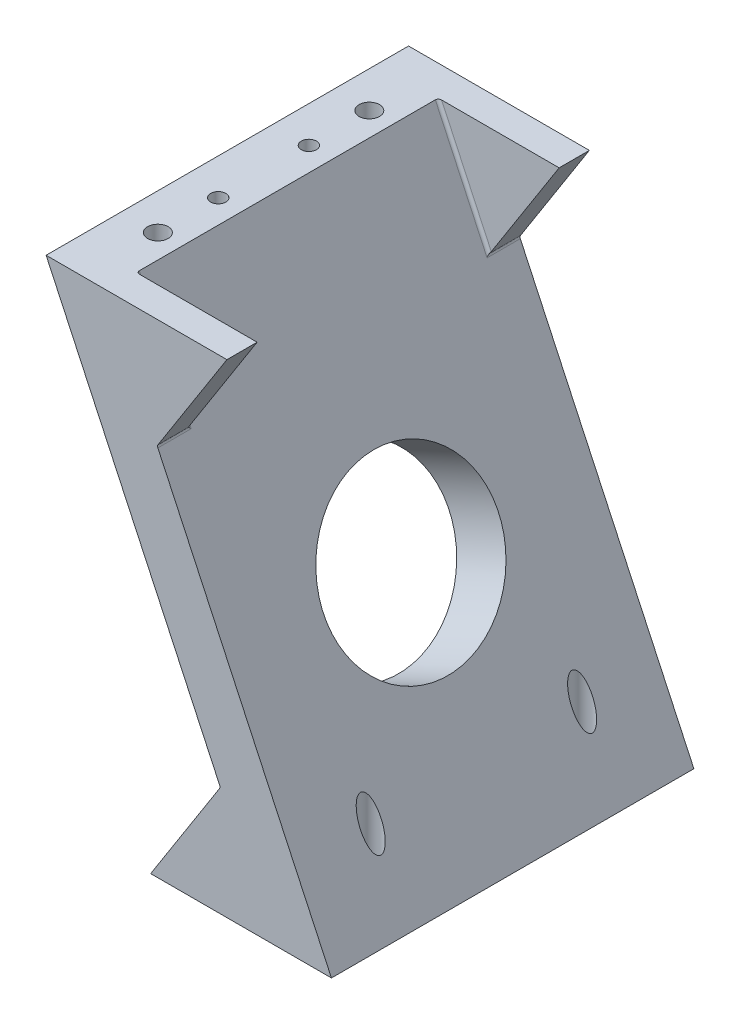
ISO-10303-21;
HEADER;
FILE_DESCRIPTION(('STEP AP214'),'2;1');
FILE_NAME('part.step','',(''),(''),'','','');
FILE_SCHEMA(('AUTOMOTIVE_DESIGN { 1 0 10303 214 1 1 1 1 }'));
ENDSEC;
DATA;
#1=APPLICATION_CONTEXT('core data for automotive mechanical design processes');
#2=APPLICATION_PROTOCOL_DEFINITION('international standard','automotive_design',2000,#1);
#3=PRODUCT_CONTEXT('',#1,'mechanical');
#4=PRODUCT('Part','Part','',(#3));
#5=PRODUCT_RELATED_PRODUCT_CATEGORY('part','',(#4));
#6=PRODUCT_DEFINITION_FORMATION('','',#4);
#7=PRODUCT_DEFINITION_CONTEXT('part definition',#1,'design');
#8=PRODUCT_DEFINITION('design','',#6,#7);
#9=PRODUCT_DEFINITION_SHAPE('','',#8);
#10=(LENGTH_UNIT() NAMED_UNIT(*) SI_UNIT(.MILLI.,.METRE.));
#11=(NAMED_UNIT(*) PLANE_ANGLE_UNIT() SI_UNIT($,.RADIAN.));
#12=(NAMED_UNIT(*) SI_UNIT($,.STERADIAN.) SOLID_ANGLE_UNIT());
#13=UNCERTAINTY_MEASURE_WITH_UNIT(LENGTH_MEASURE(1.E-05),#10,'distance_accuracy_value','');
#14=(GEOMETRIC_REPRESENTATION_CONTEXT(3) GLOBAL_UNCERTAINTY_ASSIGNED_CONTEXT((#13)) GLOBAL_UNIT_ASSIGNED_CONTEXT((#10,
#11,#12)) REPRESENTATION_CONTEXT('',''));
#15=CARTESIAN_POINT('',(0.,0.,0.));
#16=DIRECTION('',(0.,0.,1.));
#17=DIRECTION('',(1.,0.,0.));
#18=AXIS2_PLACEMENT_3D('',#15,#16,#17);
#19=CARTESIAN_POINT('',(-130.638727776725,45.9016990716547,-49.));
#20=DIRECTION('',(0.,-1.,0.));
#21=DIRECTION('',(1.,0.,0.));
#22=AXIS2_PLACEMENT_3D('',#19,#20,#21);
#23=PLANE('',#22);
#24=CARTESIAN_POINT('',(-138.499530318051,45.9016990716547,-15.));
#25=DIRECTION('',(0.,1.,0.));
#26=DIRECTION('',(0.,0.,1.));
#27=AXIS2_PLACEMENT_3D('',#24,#25,#26);
#28=CIRCLE('',#27,2.5);
#29=CARTESIAN_POINT('',(-138.499530318051,45.9016990716547,-12.5));
#30=VERTEX_POINT('',#29);
#31=EDGE_CURVE('E231',#30,#30,#28,.T.);
#32=ORIENTED_EDGE('',*,*,#31,.F.);
#33=EDGE_LOOP('',(#32));
#34=FACE_BOUND('',#33,.T.);
#35=CARTESIAN_POINT('',(-138.499530318051,45.9016990716547,15.));
#36=DIRECTION('',(0.,1.,0.));
#37=DIRECTION('',(0.,0.,1.));
#38=AXIS2_PLACEMENT_3D('',#35,#36,#37);
#39=CIRCLE('',#38,2.5);
#40=CARTESIAN_POINT('',(-138.499530318051,45.9016990716547,17.5));
#41=VERTEX_POINT('',#40);
#42=EDGE_CURVE('E237',#41,#41,#39,.T.);
#43=ORIENTED_EDGE('',*,*,#42,.F.);
#44=EDGE_LOOP('',(#43));
#45=FACE_BOUND('',#44,.T.);
#46=CARTESIAN_POINT('',(-138.499530318051,45.9016990716547,-35.));
#47=DIRECTION('',(0.,-1.,0.));
#48=DIRECTION('',(1.,0.,0.));
#49=AXIS2_PLACEMENT_3D('',#46,#47,#48);
#50=CIRCLE('',#49,3.39999999999997);
#51=CARTESIAN_POINT('',(-135.099530318051,45.9016990716547,-35.));
#52=VERTEX_POINT('',#51);
#53=EDGE_CURVE('E246',#52,#52,#50,.T.);
#54=ORIENTED_EDGE('',*,*,#53,.T.);
#55=EDGE_LOOP('',(#54));
#56=FACE_BOUND('',#55,.T.);
#57=CARTESIAN_POINT('',(-138.499530318051,45.9016990716547,35.));
#58=DIRECTION('',(0.,-1.,0.));
#59=DIRECTION('',(1.,0.,0.));
#60=AXIS2_PLACEMENT_3D('',#57,#58,#59);
#61=CIRCLE('',#60,3.39999999999997);
#62=CARTESIAN_POINT('',(-135.099530318051,45.9016990716547,35.));
#63=VERTEX_POINT('',#62);
#64=EDGE_CURVE('E252',#63,#63,#61,.T.);
#65=ORIENTED_EDGE('',*,*,#64,.T.);
#66=EDGE_LOOP('',(#65));
#67=FACE_BOUND('',#66,.T.);
#68=DIRECTION('',(1.,0.,0.));
#69=VECTOR('',#68,1.);
#70=CARTESIAN_POINT('',(0.,45.9016990716547,60.));
#71=LINE('',#70,#69);
#72=CARTESIAN_POINT('',(-150.499530318051,45.9016990716547,60.));
#73=VERTEX_POINT('',#72);
#74=CARTESIAN_POINT('',(-90.6387277767261,45.9016990716547,60.));
#75=VERTEX_POINT('',#74);
#76=EDGE_CURVE('E264',#73,#75,#71,.T.);
#77=ORIENTED_EDGE('',*,*,#76,.T.);
#78=DIRECTION('',(0.,0.,1.));
#79=VECTOR('',#78,1.);
#80=CARTESIAN_POINT('',(-90.6387277767261,45.9016990716547,-60.));
#81=LINE('',#80,#79);
#82=CARTESIAN_POINT('',(-90.6387277767261,45.9016990716547,50.));
#83=VERTEX_POINT('',#82);
#84=EDGE_CURVE('E355',#83,#75,#81,.T.);
#85=ORIENTED_EDGE('',*,*,#84,.F.);
#86=DIRECTION('',(-1.,0.,0.));
#87=VECTOR('',#86,1.);
#88=CARTESIAN_POINT('',(0.,45.9016990716547,50.));
#89=LINE('',#88,#87);
#90=CARTESIAN_POINT('',(-129.535349857763,45.9016990716547,50.));
#91=VERTEX_POINT('',#90);
#92=EDGE_CURVE('E261',#83,#91,#89,.T.);
#93=ORIENTED_EDGE('',*,*,#92,.T.);
#94=CARTESIAN_POINT('',(-129.535349857763,45.9016990716547,49.));
#95=DIRECTION('',(0.,1.,0.));
#96=DIRECTION('',(-1.,0.,0.));
#97=AXIS2_PLACEMENT_3D('',#94,#95,#96);
#98=ELLIPSE('',#97,1.10337791896249,1.);
#99=CARTESIAN_POINT('',(-130.638727776725,45.9016990716547,49.));
#100=VERTEX_POINT('',#99);
#101=EDGE_CURVE('E397',#91,#100,#98,.F.);
#102=ORIENTED_EDGE('',*,*,#101,.T.);
#103=DIRECTION('',(0.,0.,1.));
#104=VECTOR('',#103,1.);
#105=CARTESIAN_POINT('',(-130.638727776725,45.9016990716547,-50.));
#106=LINE('',#105,#104);
#107=CARTESIAN_POINT('',(-130.638727776725,45.9016990716547,-49.));
#108=VERTEX_POINT('',#107);
#109=EDGE_CURVE('E363',#108,#100,#106,.T.);
#110=ORIENTED_EDGE('',*,*,#109,.F.);
#111=CARTESIAN_POINT('',(-129.535349857763,45.9016990716547,-49.));
#112=DIRECTION('',(0.,1.,0.));
#113=DIRECTION('',(1.,0.,0.));
#114=AXIS2_PLACEMENT_3D('',#111,#112,#113);
#115=ELLIPSE('',#114,1.10337791896249,1.);
#116=CARTESIAN_POINT('',(-129.535349857763,45.9016990716547,-50.));
#117=VERTEX_POINT('',#116);
#118=EDGE_CURVE('E393',#108,#117,#115,.F.);
#119=ORIENTED_EDGE('',*,*,#118,.T.);
#120=DIRECTION('',(-1.,0.,0.));
#121=VECTOR('',#120,1.);
#122=CARTESIAN_POINT('',(0.,45.9016990716547,-50.));
#123=LINE('',#122,#121);
#124=CARTESIAN_POINT('',(-90.6387277767261,45.9016990716547,-50.));
#125=VERTEX_POINT('',#124);
#126=EDGE_CURVE('E365',#125,#117,#123,.T.);
#127=ORIENTED_EDGE('',*,*,#126,.F.);
#128=CARTESIAN_POINT('',(-90.6387277767261,45.9016990716547,-60.));
#129=VERTEX_POINT('',#128);
#130=EDGE_CURVE('E54',#129,#125,#81,.T.);
#131=ORIENTED_EDGE('',*,*,#130,.F.);
#132=DIRECTION('',(1.,0.,0.));
#133=VECTOR('',#132,1.);
#134=CARTESIAN_POINT('',(0.,45.9016990716547,-60.));
#135=LINE('',#134,#133);
#136=CARTESIAN_POINT('',(-150.499530318051,45.9016990716547,-60.));
#137=VERTEX_POINT('',#136);
#138=EDGE_CURVE('E262',#137,#129,#135,.T.);
#139=ORIENTED_EDGE('',*,*,#138,.F.);
#140=DIRECTION('',(0.,0.,-1.));
#141=VECTOR('',#140,1.);
#142=CARTESIAN_POINT('',(-150.499530318051,45.9016990716547,60.));
#143=LINE('',#142,#141);
#144=EDGE_CURVE('E332',#73,#137,#143,.T.);
#145=ORIENTED_EDGE('',*,*,#144,.F.);
#146=EDGE_LOOP('',(#77,#85,#93,#102,#110,#119,#127,#131,#139,#145));
#147=FACE_BOUND('',#146,.T.);
#148=ADVANCED_FACE('F37',(#34,#45,#56,#67,#147),#23,.F.);
#149=CARTESIAN_POINT('',(-56.0295024719251,-114.098300928345,-60.));
#150=DIRECTION('',(0.,1.,0.));
#151=DIRECTION('',(0.,0.,1.));
#152=AXIS2_PLACEMENT_3D('',#149,#150,#151);
#153=PLANE('',#152);
#154=CARTESIAN_POINT('',(-68.0295024719251,-114.098300928345,-15.));
#155=DIRECTION('',(0.,-1.,0.));
#156=DIRECTION('',(0.,0.,-1.));
#157=AXIS2_PLACEMENT_3D('',#154,#155,#156);
#158=CIRCLE('',#157,2.49999999999999);
#159=CARTESIAN_POINT('',(-68.0295024719251,-114.098300928345,-17.5));
#160=VERTEX_POINT('',#159);
#161=EDGE_CURVE('E207',#160,#160,#158,.T.);
#162=ORIENTED_EDGE('',*,*,#161,.F.);
#163=EDGE_LOOP('',(#162));
#164=FACE_BOUND('',#163,.T.);
#165=CARTESIAN_POINT('',(-68.0295024719251,-114.098300928345,15.));
#166=DIRECTION('',(0.,-1.,0.));
#167=DIRECTION('',(0.,0.,-1.));
#168=AXIS2_PLACEMENT_3D('',#165,#166,#167);
#169=CIRCLE('',#168,2.49999999999999);
#170=CARTESIAN_POINT('',(-68.0295024719251,-114.098300928345,12.5));
#171=VERTEX_POINT('',#170);
#172=EDGE_CURVE('E213',#171,#171,#169,.T.);
#173=ORIENTED_EDGE('',*,*,#172,.F.);
#174=EDGE_LOOP('',(#173));
#175=FACE_BOUND('',#174,.T.);
#176=CARTESIAN_POINT('',(-68.0295024719251,-114.098300928345,35.));
#177=DIRECTION('',(0.,1.,0.));
#178=DIRECTION('',(0.,0.,1.));
#179=AXIS2_PLACEMENT_3D('',#176,#177,#178);
#180=CIRCLE('',#179,3.39999999999998);
#181=CARTESIAN_POINT('',(-68.0295024719251,-114.098300928345,38.4));
#182=VERTEX_POINT('',#181);
#183=EDGE_CURVE('E222',#182,#182,#180,.T.);
#184=ORIENTED_EDGE('',*,*,#183,.T.);
#185=EDGE_LOOP('',(#184));
#186=FACE_BOUND('',#185,.T.);
#187=CARTESIAN_POINT('',(-68.0295024719251,-114.098300928345,-35.));
#188=DIRECTION('',(0.,1.,0.));
#189=DIRECTION('',(0.,0.,1.));
#190=AXIS2_PLACEMENT_3D('',#187,#188,#189);
#191=CIRCLE('',#190,3.39999999999998);
#192=CARTESIAN_POINT('',(-68.0295024719251,-114.098300928345,-31.6));
#193=VERTEX_POINT('',#192);
#194=EDGE_CURVE('E228',#193,#193,#191,.T.);
#195=ORIENTED_EDGE('',*,*,#194,.T.);
#196=EDGE_LOOP('',(#195));
#197=FACE_BOUND('',#196,.T.);
#198=DIRECTION('',(0.,0.,-1.));
#199=VECTOR('',#198,1.);
#200=CARTESIAN_POINT('',(-56.0295024719251,-114.098300928345,60.));
#201=LINE('',#200,#199);
#202=CARTESIAN_POINT('',(-56.0295024719251,-114.098300928345,60.));
#203=VERTEX_POINT('',#202);
#204=CARTESIAN_POINT('',(-56.0295024719251,-114.098300928345,-60.));
#205=VERTEX_POINT('',#204);
#206=EDGE_CURVE('E331',#203,#205,#201,.T.);
#207=ORIENTED_EDGE('',*,*,#206,.F.);
#208=DIRECTION('',(-1.,0.,0.));
#209=VECTOR('',#208,1.);
#210=CARTESIAN_POINT('',(0.,-114.098300928345,60.));
#211=LINE('',#210,#209);
#212=CARTESIAN_POINT('',(-115.89030501325,-114.098300928345,60.));
#213=VERTEX_POINT('',#212);
#214=EDGE_CURVE('E384',#203,#213,#211,.T.);
#215=ORIENTED_EDGE('',*,*,#214,.T.);
#216=DIRECTION('',(0.,0.,1.));
#217=VECTOR('',#216,1.);
#218=CARTESIAN_POINT('',(-115.89030501325,-114.098300928345,-60.));
#219=LINE('',#218,#217);
#220=CARTESIAN_POINT('',(-115.89030501325,-114.098300928345,50.));
#221=VERTEX_POINT('',#220);
#222=EDGE_CURVE('E353',#221,#213,#219,.T.);
#223=ORIENTED_EDGE('',*,*,#222,.F.);
#224=DIRECTION('',(1.,0.,0.));
#225=VECTOR('',#224,1.);
#226=CARTESIAN_POINT('',(0.,-114.098300928345,50.));
#227=LINE('',#226,#225);
#228=CARTESIAN_POINT('',(-76.9936829322129,-114.098300928345,50.));
#229=VERTEX_POINT('',#228);
#230=EDGE_CURVE('E394',#221,#229,#227,.T.);
#231=ORIENTED_EDGE('',*,*,#230,.T.);
#232=CARTESIAN_POINT('',(-76.9936829322129,-114.098300928345,49.));
#233=DIRECTION('',(0.,-1.,0.));
#234=DIRECTION('',(1.,0.,0.));
#235=AXIS2_PLACEMENT_3D('',#232,#233,#234);
#236=ELLIPSE('',#235,1.10337791896249,1.);
#237=CARTESIAN_POINT('',(-75.8903050132504,-114.098300928345,49.));
#238=VERTEX_POINT('',#237);
#239=EDGE_CURVE('E387',#229,#238,#236,.F.);
#240=ORIENTED_EDGE('',*,*,#239,.T.);
#241=DIRECTION('',(0.,0.,1.));
#242=VECTOR('',#241,1.);
#243=CARTESIAN_POINT('',(-75.8903050132504,-114.098300928345,-50.));
#244=LINE('',#243,#242);
#245=CARTESIAN_POINT('',(-75.8903050132504,-114.098300928345,-49.));
#246=VERTEX_POINT('',#245);
#247=EDGE_CURVE('E359',#246,#238,#244,.T.);
#248=ORIENTED_EDGE('',*,*,#247,.F.);
#249=CARTESIAN_POINT('',(-76.9936829322129,-114.098300928345,-49.));
#250=DIRECTION('',(0.,-1.,0.));
#251=DIRECTION('',(-1.,0.,0.));
#252=AXIS2_PLACEMENT_3D('',#249,#250,#251);
#253=ELLIPSE('',#252,1.10337791896249,1.);
#254=CARTESIAN_POINT('',(-76.9936829322129,-114.098300928345,-50.));
#255=VERTEX_POINT('',#254);
#256=EDGE_CURVE('E390',#246,#255,#253,.F.);
#257=ORIENTED_EDGE('',*,*,#256,.T.);
#258=DIRECTION('',(1.,0.,0.));
#259=VECTOR('',#258,1.);
#260=CARTESIAN_POINT('',(0.,-114.098300928345,-50.));
#261=LINE('',#260,#259);
#262=CARTESIAN_POINT('',(-115.89030501325,-114.098300928345,-50.));
#263=VERTEX_POINT('',#262);
#264=EDGE_CURVE('E377',#263,#255,#261,.T.);
#265=ORIENTED_EDGE('',*,*,#264,.F.);
#266=CARTESIAN_POINT('',(-115.89030501325,-114.098300928345,-60.));
#267=VERTEX_POINT('',#266);
#268=EDGE_CURVE('E342',#267,#263,#219,.T.);
#269=ORIENTED_EDGE('',*,*,#268,.F.);
#270=DIRECTION('',(-1.,0.,0.));
#271=VECTOR('',#270,1.);
#272=CARTESIAN_POINT('',(0.,-114.098300928345,-60.));
#273=LINE('',#272,#271);
#274=EDGE_CURVE('E263',#205,#267,#273,.T.);
#275=ORIENTED_EDGE('',*,*,#274,.F.);
#276=EDGE_LOOP('',(#207,#215,#223,#231,#240,#248,#257,#265,#269,#275));
#277=FACE_BOUND('',#276,.T.);
#278=ADVANCED_FACE('F440',(#164,#175,#186,#197,#277),#153,.F.);
#279=CARTESIAN_POINT('',(0.,0.,60.));
#280=DIRECTION('',(0.,0.,1.));
#281=DIRECTION('',(1.,0.,0.));
#282=AXIS2_PLACEMENT_3D('',#279,#280,#281);
#283=PLANE('',#282);
#284=ORIENTED_EDGE('',*,*,#76,.F.);
#285=DIRECTION('',(0.422618261740701,-0.906307787036649,0.));
#286=VECTOR('',#285,1.);
#287=CARTESIAN_POINT('',(-75.8903050132504,-114.098300928345,60.));
#288=LINE('',#287,#286);
#289=CARTESIAN_POINT('',(-93.0268918008409,-77.348771968445,60.));
#290=VERTEX_POINT('',#289);
#291=EDGE_CURVE('E334',#73,#290,#288,.T.);
#292=ORIENTED_EDGE('',*,*,#291,.T.);
#293=CARTESIAN_POINT('',(-93.9331995878775,-77.7713902301857,60.));
#294=DIRECTION('',(0.,0.,1.));
#295=DIRECTION('',(1.,0.,0.));
#296=AXIS2_PLACEMENT_3D('',#293,#294,#295);
#297=CIRCLE('',#296,1.);
#298=CARTESIAN_POINT('',(-93.0898081420647,-78.3086898385325,60.));
#299=VERTEX_POINT('',#298);
#300=EDGE_CURVE('E280',#290,#299,#297,.F.);
#301=ORIENTED_EDGE('',*,*,#300,.T.);
#302=DIRECTION('',(0.537299608346823,0.843391445812886,0.));
#303=VECTOR('',#302,1.);
#304=CARTESIAN_POINT('',(-30.7297428257698,19.5770052765603,60.));
#305=LINE('',#304,#303);
#306=EDGE_CURVE('E347',#213,#299,#305,.T.);
#307=ORIENTED_EDGE('',*,*,#306,.F.);
#308=ORIENTED_EDGE('',*,*,#214,.F.);
#309=DIRECTION('',(-0.422618261740701,0.906307787036649,0.));
#310=VECTOR('',#309,1.);
#311=CARTESIAN_POINT('',(-130.638727776725,45.9016990716547,60.));
#312=LINE('',#311,#310);
#313=CARTESIAN_POINT('',(-113.502140989135,9.15217011175499,60.));
#314=VERTEX_POINT('',#313);
#315=EDGE_CURVE('E339',#203,#314,#312,.T.);
#316=ORIENTED_EDGE('',*,*,#315,.T.);
#317=CARTESIAN_POINT('',(-112.595833202098,9.5747883734957,60.));
#318=DIRECTION('',(0.,0.,1.));
#319=DIRECTION('',(1.,0.,0.));
#320=AXIS2_PLACEMENT_3D('',#317,#318,#319);
#321=CIRCLE('',#320,1.);
#322=CARTESIAN_POINT('',(-113.439224647911,10.1120879818425,60.));
#323=VERTEX_POINT('',#322);
#324=EDGE_CURVE('E282',#314,#323,#321,.F.);
#325=ORIENTED_EDGE('',*,*,#324,.T.);
#326=DIRECTION('',(-0.537299608346819,-0.843391445812889,0.));
#327=VECTOR('',#326,1.);
#328=CARTESIAN_POINT('',(-85.2726883314845,54.3246937950942,60.));
#329=LINE('',#328,#327);
#330=EDGE_CURVE('E356',#75,#323,#329,.T.);
#331=ORIENTED_EDGE('',*,*,#330,.F.);
#332=EDGE_LOOP('',(#284,#292,#301,#307,#308,#316,#325,#331));
#333=FACE_BOUND('',#332,.T.);
#334=ADVANCED_FACE('F39',(#333),#283,.T.);
#335=CARTESIAN_POINT('',(0.,0.,-50.));
#336=DIRECTION('',(0.,0.,1.));
#337=DIRECTION('',(1.,0.,0.));
#338=AXIS2_PLACEMENT_3D('',#335,#336,#337);
#339=PLANE('',#338);
#340=ORIENTED_EDGE('',*,*,#126,.T.);
#341=DIRECTION('',(0.422618261740701,-0.906307787036649,0.));
#342=VECTOR('',#341,1.);
#343=CARTESIAN_POINT('',(-88.8181631295913,-41.4165896505886,-50.));
#344=LINE('',#343,#342);
#345=CARTESIAN_POINT('',(-113.09692704629,10.6493875901894,-50.));
#346=VERTEX_POINT('',#345);
#347=EDGE_CURVE('E316',#117,#346,#344,.T.);
#348=ORIENTED_EDGE('',*,*,#347,.T.);
#349=DIRECTION('',(-0.537299608346819,-0.843391445812889,0.));
#350=VECTOR('',#349,1.);
#351=CARTESIAN_POINT('',(-85.2726883314845,54.3246937950942,-50.));
#352=LINE('',#351,#350);
#353=EDGE_CURVE('E369',#125,#346,#352,.T.);
#354=ORIENTED_EDGE('',*,*,#353,.F.);
#355=EDGE_LOOP('',(#340,#348,#354));
#356=FACE_BOUND('',#355,.T.);
#357=ADVANCED_FACE('F428',(#356),#339,.T.);
#358=CARTESIAN_POINT('',(-85.2726883314845,54.3246937950942,-60.));
#359=DIRECTION('',(-0.843391445812889,0.537299608346819,0.));
#360=DIRECTION('',(-0.537299608346819,-0.843391445812889,0.));
#361=AXIS2_PLACEMENT_3D('',#358,#359,#360);
#362=PLANE('',#361);
#363=ORIENTED_EDGE('',*,*,#353,.T.);
#364=CARTESIAN_POINT('',(-113.09692704629,10.6493875901893,-49.));
#365=DIRECTION('',(-0.843391445812889,0.537299608346819,0.));
#366=DIRECTION('',(-0.537299608346819,-0.843391445812889,0.));
#367=AXIS2_PLACEMENT_3D('',#364,#365,#366);
#368=ELLIPSE('',#367,1.18568904743416,1.);
#369=CARTESIAN_POINT('',(-113.439224647911,10.1120879818425,-49.8433914458134));
#370=VERTEX_POINT('',#369);
#371=EDGE_CURVE('E286',#346,#370,#368,.T.);
#372=ORIENTED_EDGE('',*,*,#371,.T.);
#373=DIRECTION('',(0.,0.,1.));
#374=VECTOR('',#373,1.);
#375=CARTESIAN_POINT('',(-113.439224647911,10.1120879818425,-60.));
#376=LINE('',#375,#374);
#377=CARTESIAN_POINT('',(-113.439224647911,10.1120879818425,-60.));
#378=VERTEX_POINT('',#377);
#379=EDGE_CURVE('E318',#370,#378,#376,.F.);
#380=ORIENTED_EDGE('',*,*,#379,.T.);
#381=DIRECTION('',(-0.537299608346819,-0.843391445812889,0.));
#382=VECTOR('',#381,1.);
#383=CARTESIAN_POINT('',(-85.2726883314845,54.3246937950942,-60.));
#384=LINE('',#383,#382);
#385=EDGE_CURVE('E360',#129,#378,#384,.T.);
#386=ORIENTED_EDGE('',*,*,#385,.F.);
#387=ORIENTED_EDGE('',*,*,#130,.T.);
#388=EDGE_LOOP('',(#363,#372,#380,#386,#387));
#389=FACE_BOUND('',#388,.T.);
#390=ADVANCED_FACE('F429',(#389),#362,.F.);
#391=CARTESIAN_POINT('',(-112.595833202098,9.5747883734957,60.));
#392=DIRECTION('',(0.,0.,-1.));
#393=DIRECTION('',(-1.,0.,0.));
#394=AXIS2_PLACEMENT_3D('',#391,#392,#393);
#395=CYLINDRICAL_SURFACE('',#394,1.);
#396=CARTESIAN_POINT('',(-112.595833202098,9.5747883734957,-60.));
#397=DIRECTION('',(0.,0.,1.));
#398=DIRECTION('',(1.,0.,0.));
#399=AXIS2_PLACEMENT_3D('',#396,#397,#398);
#400=CIRCLE('',#399,1.);
#401=CARTESIAN_POINT('',(-113.502140989135,9.15217011175499,-60.));
#402=VERTEX_POINT('',#401);
#403=EDGE_CURVE('E289',#378,#402,#400,.T.);
#404=ORIENTED_EDGE('',*,*,#403,.F.);
#405=ORIENTED_EDGE('',*,*,#379,.F.);
#406=CARTESIAN_POINT('',(-112.595833202098,9.5747883734957,-49.));
#407=DIRECTION('',(0.298836238730121,-0.640856382055788,-0.707106781186547));
#408=DIRECTION('',(0.298836238730121,-0.640856382055788,0.707106781186547));
#409=AXIS2_PLACEMENT_3D('',#406,#407,#408);
#410=ELLIPSE('',#409,1.41421356237309,1.);
#411=CARTESIAN_POINT('',(-113.502140989135,9.152170111755,-49.));
#412=VERTEX_POINT('',#411);
#413=EDGE_CURVE('E270',#370,#412,#410,.F.);
#414=ORIENTED_EDGE('',*,*,#413,.T.);
#415=DIRECTION('',(0.,0.,1.));
#416=VECTOR('',#415,1.);
#417=CARTESIAN_POINT('',(-113.502140989135,9.152170111755,-50.));
#418=LINE('',#417,#416);
#419=EDGE_CURVE('E320',#402,#412,#418,.T.);
#420=ORIENTED_EDGE('',*,*,#419,.F.);
#421=EDGE_LOOP('',(#404,#405,#414,#420));
#422=FACE_BOUND('',#421,.T.);
#423=ADVANCED_FACE('F433',(#422),#395,.F.);
#424=CARTESIAN_POINT('',(-130.638727776725,45.9016990716547,60.));
#425=DIRECTION('',(-0.906307787036649,-0.422618261740701,0.));
#426=DIRECTION('',(0.422618261740701,-0.906307787036649,0.));
#427=AXIS2_PLACEMENT_3D('',#424,#425,#426);
#428=PLANE('',#427);
#429=CARTESIAN_POINT('',(-68.0295024719251,-88.3642178822307,35.));
#430=DIRECTION('',(-0.906307787036649,-0.422618261740701,0.));
#431=DIRECTION('',(0.422618261740701,-0.906307787036649,0.));
#432=AXIS2_PLACEMENT_3D('',#429,#430,#431);
#433=ELLIPSE('',#432,8.04508538271841,3.39999999999998);
#434=CARTESIAN_POINT('',(-64.6295024719251,-95.6555414119631,35.));
#435=VERTEX_POINT('',#434);
#436=EDGE_CURVE('E219',#435,#435,#433,.T.);
#437=ORIENTED_EDGE('',*,*,#436,.T.);
#438=EDGE_LOOP('',(#437));
#439=FACE_BOUND('',#438,.T.);
#440=CARTESIAN_POINT('',(-68.0295024719251,-88.3642178822307,-35.));
#441=DIRECTION('',(-0.906307787036649,-0.422618261740701,0.));
#442=DIRECTION('',(0.422618261740701,-0.906307787036649,0.));
#443=AXIS2_PLACEMENT_3D('',#440,#441,#442);
#444=ELLIPSE('',#443,8.04508538271841,3.39999999999998);
#445=CARTESIAN_POINT('',(-64.6295024719251,-95.6555414119631,-35.));
#446=VERTEX_POINT('',#445);
#447=EDGE_CURVE('E225',#446,#446,#444,.T.);
#448=ORIENTED_EDGE('',*,*,#447,.T.);
#449=EDGE_LOOP('',(#448));
#450=FACE_BOUND('',#449,.T.);
#451=CARTESIAN_POINT('',(-89.7244709166279,-41.8392079123293,0.));
#452=DIRECTION('',(0.906307787036649,0.422618261740701,0.));
#453=DIRECTION('',(-0.422618261740701,0.906307787036649,0.));
#454=AXIS2_PLACEMENT_3D('',#451,#452,#453);
#455=CIRCLE('',#454,28.9999999999858);
#456=CARTESIAN_POINT('',(-101.980400507102,-15.5562820882793,0.));
#457=VERTEX_POINT('',#456);
#458=EDGE_CURVE('E255',#457,#457,#455,.T.);
#459=ORIENTED_EDGE('',*,*,#458,.F.);
#460=EDGE_LOOP('',(#459));
#461=FACE_BOUND('',#460,.T.);
#462=DIRECTION('',(-0.422618261740701,0.906307787036649,0.));
#463=VECTOR('',#462,1.);
#464=CARTESIAN_POINT('',(-130.638727776725,45.9016990716547,-60.));
#465=LINE('',#464,#463);
#466=EDGE_CURVE('E338',#205,#402,#465,.T.);
#467=ORIENTED_EDGE('',*,*,#466,.T.);
#468=ORIENTED_EDGE('',*,*,#419,.T.);
#469=DIRECTION('',(0.422618261740701,-0.906307787036649,0.));
#470=VECTOR('',#469,1.);
#471=CARTESIAN_POINT('',(-130.638727776725,45.9016990716547,-49.));
#472=LINE('',#471,#470);
#473=EDGE_CURVE('E323',#412,#108,#472,.F.);
#474=ORIENTED_EDGE('',*,*,#473,.T.);
#475=ORIENTED_EDGE('',*,*,#109,.T.);
#476=DIRECTION('',(0.422618261740701,-0.906307787036649,0.));
#477=VECTOR('',#476,1.);
#478=CARTESIAN_POINT('',(-113.733997307097,9.64938759018934,49.));
#479=LINE('',#478,#477);
#480=CARTESIAN_POINT('',(-113.502140989135,9.152170111755,49.));
#481=VERTEX_POINT('',#480);
#482=EDGE_CURVE('E326',#100,#481,#479,.T.);
#483=ORIENTED_EDGE('',*,*,#482,.T.);
#484=DIRECTION('',(0.,0.,1.));
#485=VECTOR('',#484,1.);
#486=CARTESIAN_POINT('',(-113.502140989135,9.152170111755,60.));
#487=LINE('',#486,#485);
#488=EDGE_CURVE('E329',#481,#314,#487,.T.);
#489=ORIENTED_EDGE('',*,*,#488,.T.);
#490=ORIENTED_EDGE('',*,*,#315,.F.);
#491=ORIENTED_EDGE('',*,*,#206,.T.);
#492=EDGE_LOOP('',(#467,#468,#474,#475,#483,#489,#490,#491));
#493=FACE_BOUND('',#492,.T.);
#494=ADVANCED_FACE('F418',(#439,#450,#461,#493),#428,.F.);
#495=CARTESIAN_POINT('',(-112.595833202098,9.5747883734957,60.));
#496=DIRECTION('',(0.,0.,-1.));
#497=DIRECTION('',(-1.,0.,0.));
#498=AXIS2_PLACEMENT_3D('',#495,#496,#497);
#499=CYLINDRICAL_SURFACE('',#498,1.);
#500=ORIENTED_EDGE('',*,*,#324,.F.);
#501=ORIENTED_EDGE('',*,*,#488,.F.);
#502=CARTESIAN_POINT('',(-112.595833202098,9.5747883734957,49.));
#503=DIRECTION('',(-0.298836238730121,0.640856382055788,-0.707106781186547));
#504=DIRECTION('',(0.298836238730121,-0.640856382055788,-0.707106781186547));
#505=AXIS2_PLACEMENT_3D('',#502,#503,#504);
#506=ELLIPSE('',#505,1.41421356237309,1.);
#507=CARTESIAN_POINT('',(-113.439224647911,10.1120879818425,49.8433914458134));
#508=VERTEX_POINT('',#507);
#509=EDGE_CURVE('E268',#508,#481,#506,.F.);
#510=ORIENTED_EDGE('',*,*,#509,.F.);
#511=DIRECTION('',(0.,0.,1.));
#512=VECTOR('',#511,1.);
#513=CARTESIAN_POINT('',(-113.439224647911,10.1120879818425,50.));
#514=LINE('',#513,#512);
#515=EDGE_CURVE('E311',#323,#508,#514,.F.);
#516=ORIENTED_EDGE('',*,*,#515,.F.);
#517=EDGE_LOOP('',(#500,#501,#510,#516));
#518=FACE_BOUND('',#517,.T.);
#519=ADVANCED_FACE('F525',(#518),#499,.F.);
#520=ORIENTED_EDGE('',*,*,#330,.T.);
#521=ORIENTED_EDGE('',*,*,#515,.T.);
#522=CARTESIAN_POINT('',(-113.09692704629,10.6493875901894,49.));
#523=DIRECTION('',(-0.843391445812889,0.537299608346819,0.));
#524=DIRECTION('',(0.537299608346819,0.843391445812889,0.));
#525=AXIS2_PLACEMENT_3D('',#522,#523,#524);
#526=ELLIPSE('',#525,1.18568904743416,1.);
#527=CARTESIAN_POINT('',(-113.09692704629,10.6493875901894,50.));
#528=VERTEX_POINT('',#527);
#529=EDGE_CURVE('E284',#508,#528,#526,.T.);
#530=ORIENTED_EDGE('',*,*,#529,.T.);
#531=DIRECTION('',(-0.537299608346819,-0.843391445812889,0.));
#532=VECTOR('',#531,1.);
#533=CARTESIAN_POINT('',(-85.2726883314845,54.3246937950942,50.));
#534=LINE('',#533,#532);
#535=EDGE_CURVE('E272',#83,#528,#534,.T.);
#536=ORIENTED_EDGE('',*,*,#535,.F.);
#537=ORIENTED_EDGE('',*,*,#84,.T.);
#538=EDGE_LOOP('',(#520,#521,#530,#536,#537));
#539=FACE_BOUND('',#538,.T.);
#540=ADVANCED_FACE('F528',(#539),#362,.F.);
#541=CARTESIAN_POINT('',(0.,0.,50.));
#542=DIRECTION('',(0.,0.,1.));
#543=DIRECTION('',(1.,0.,0.));
#544=AXIS2_PLACEMENT_3D('',#541,#542,#543);
#545=PLANE('',#544);
#546=ORIENTED_EDGE('',*,*,#535,.T.);
#547=DIRECTION('',(0.422618261740701,-0.906307787036649,0.));
#548=VECTOR('',#547,1.);
#549=CARTESIAN_POINT('',(-129.732419989689,46.3243173333954,50.));
#550=LINE('',#549,#548);
#551=EDGE_CURVE('E313',#528,#91,#550,.F.);
#552=ORIENTED_EDGE('',*,*,#551,.T.);
#553=ORIENTED_EDGE('',*,*,#92,.F.);
#554=EDGE_LOOP('',(#546,#552,#553));
#555=FACE_BOUND('',#554,.T.);
#556=ADVANCED_FACE('F411',(#555),#545,.F.);
#557=CARTESIAN_POINT('',(-129.732419989689,46.3243173333954,49.));
#558=DIRECTION('',(-0.422618261740701,0.906307787036649,0.));
#559=DIRECTION('',(-0.906307787036649,-0.422618261740701,0.));
#560=AXIS2_PLACEMENT_3D('',#557,#558,#559);
#561=CYLINDRICAL_SURFACE('',#560,1.);
#562=ORIENTED_EDGE('',*,*,#101,.F.);
#563=ORIENTED_EDGE('',*,*,#551,.F.);
#564=ORIENTED_EDGE('',*,*,#529,.F.);
#565=ORIENTED_EDGE('',*,*,#509,.T.);
#566=ORIENTED_EDGE('',*,*,#482,.F.);
#567=EDGE_LOOP('',(#562,#563,#564,#565,#566));
#568=FACE_BOUND('',#567,.T.);
#569=ADVANCED_FACE('F414',(#568),#561,.F.);
#570=CARTESIAN_POINT('',(-88.8181631295913,-41.4165896505885,-49.));
#571=DIRECTION('',(0.422618261740701,-0.906307787036649,0.));
#572=DIRECTION('',(0.906307787036649,0.422618261740701,0.));
#573=AXIS2_PLACEMENT_3D('',#570,#571,#572);
#574=CYLINDRICAL_SURFACE('',#573,1.);
#575=ORIENTED_EDGE('',*,*,#118,.F.);
#576=ORIENTED_EDGE('',*,*,#473,.F.);
#577=ORIENTED_EDGE('',*,*,#413,.F.);
#578=ORIENTED_EDGE('',*,*,#371,.F.);
#579=ORIENTED_EDGE('',*,*,#347,.F.);
#580=EDGE_LOOP('',(#575,#576,#577,#578,#579));
#581=FACE_BOUND('',#580,.T.);
#582=ADVANCED_FACE('F425',(#581),#574,.F.);
#583=CARTESIAN_POINT('',(0.,0.,-50.));
#584=DIRECTION('',(0.,0.,1.));
#585=DIRECTION('',(1.,0.,0.));
#586=AXIS2_PLACEMENT_3D('',#583,#584,#585);
#587=PLANE('',#586);
#588=ORIENTED_EDGE('',*,*,#264,.T.);
#589=DIRECTION('',(-0.422618261740701,0.906307787036649,0.));
#590=VECTOR('',#589,1.);
#591=CARTESIAN_POINT('',(-106.944318870325,-49.8689548854027,-50.));
#592=LINE('',#591,#590);
#593=CARTESIAN_POINT('',(-93.4321057436859,-78.8459894468793,-50.));
#594=VERTEX_POINT('',#593);
#595=EDGE_CURVE('E291',#255,#594,#592,.T.);
#596=ORIENTED_EDGE('',*,*,#595,.T.);
#597=DIRECTION('',(0.537299608346823,0.843391445812886,0.));
#598=VECTOR('',#597,1.);
#599=CARTESIAN_POINT('',(-30.7297428257698,19.5770052765603,-50.));
#600=LINE('',#599,#598);
#601=EDGE_CURVE('E374',#263,#594,#600,.T.);
#602=ORIENTED_EDGE('',*,*,#601,.F.);
#603=EDGE_LOOP('',(#588,#596,#602));
#604=FACE_BOUND('',#603,.T.);
#605=ADVANCED_FACE('F510',(#604),#587,.T.);
#606=CARTESIAN_POINT('',(-30.7297428257698,19.5770052765603,-60.));
#607=DIRECTION('',(0.843391445812886,-0.537299608346823,0.));
#608=DIRECTION('',(0.537299608346823,0.843391445812886,0.));
#609=AXIS2_PLACEMENT_3D('',#606,#607,#608);
#610=PLANE('',#609);
#611=ORIENTED_EDGE('',*,*,#601,.T.);
#612=CARTESIAN_POINT('',(-93.4321057436859,-78.8459894468793,-49.));
#613=DIRECTION('',(0.843391445812886,-0.537299608346823,0.));
#614=DIRECTION('',(0.537299608346823,0.843391445812886,0.));
#615=AXIS2_PLACEMENT_3D('',#612,#613,#614);
#616=ELLIPSE('',#615,1.18568904743416,1.);
#617=CARTESIAN_POINT('',(-93.0898081420647,-78.3086898385325,-49.8433914458134));
#618=VERTEX_POINT('',#617);
#619=EDGE_CURVE('E273',#594,#618,#616,.T.);
#620=ORIENTED_EDGE('',*,*,#619,.T.);
#621=DIRECTION('',(0.,0.,1.));
#622=VECTOR('',#621,1.);
#623=CARTESIAN_POINT('',(-93.0898081420647,-78.3086898385325,-60.));
#624=LINE('',#623,#622);
#625=CARTESIAN_POINT('',(-93.0898081420647,-78.3086898385325,-60.));
#626=VERTEX_POINT('',#625);
#627=EDGE_CURVE('E293',#618,#626,#624,.F.);
#628=ORIENTED_EDGE('',*,*,#627,.T.);
#629=DIRECTION('',(0.537299608346823,0.843391445812886,0.));
#630=VECTOR('',#629,1.);
#631=CARTESIAN_POINT('',(-30.7297428257698,19.5770052765603,-60.));
#632=LINE('',#631,#630);
#633=EDGE_CURVE('E350',#267,#626,#632,.T.);
#634=ORIENTED_EDGE('',*,*,#633,.F.);
#635=ORIENTED_EDGE('',*,*,#268,.T.);
#636=EDGE_LOOP('',(#611,#620,#628,#634,#635));
#637=FACE_BOUND('',#636,.T.);
#638=ADVANCED_FACE('F503',(#637),#610,.F.);
#639=CARTESIAN_POINT('',(-93.9331995878775,-77.7713902301857,60.));
#640=DIRECTION('',(0.,0.,-1.));
#641=DIRECTION('',(-1.,0.,0.));
#642=AXIS2_PLACEMENT_3D('',#639,#640,#641);
#643=CYLINDRICAL_SURFACE('',#642,1.);
#644=CARTESIAN_POINT('',(-93.9331995878775,-77.7713902301857,-60.));
#645=DIRECTION('',(0.,0.,1.));
#646=DIRECTION('',(1.,0.,0.));
#647=AXIS2_PLACEMENT_3D('',#644,#645,#646);
#648=CIRCLE('',#647,1.);
#649=CARTESIAN_POINT('',(-93.0268918008409,-77.348771968445,-60.));
#650=VERTEX_POINT('',#649);
#651=EDGE_CURVE('E276',#626,#650,#648,.T.);
#652=ORIENTED_EDGE('',*,*,#651,.F.);
#653=ORIENTED_EDGE('',*,*,#627,.F.);
#654=CARTESIAN_POINT('',(-93.9331995878775,-77.7713902301857,-49.));
#655=DIRECTION('',(-0.298836238730121,0.640856382055788,-0.707106781186547));
#656=DIRECTION('',(-0.298836238730121,0.640856382055788,0.707106781186547));
#657=AXIS2_PLACEMENT_3D('',#654,#655,#656);
#658=ELLIPSE('',#657,1.41421356237309,1.);
#659=CARTESIAN_POINT('',(-93.0268918008409,-77.348771968445,-49.));
#660=VERTEX_POINT('',#659);
#661=EDGE_CURVE('E11',#618,#660,#658,.F.);
#662=ORIENTED_EDGE('',*,*,#661,.T.);
#663=DIRECTION('',(0.,0.,1.));
#664=VECTOR('',#663,1.);
#665=CARTESIAN_POINT('',(-93.0268918008409,-77.348771968445,-50.));
#666=LINE('',#665,#664);
#667=EDGE_CURVE('E305',#650,#660,#666,.T.);
#668=ORIENTED_EDGE('',*,*,#667,.F.);
#669=EDGE_LOOP('',(#652,#653,#662,#668));
#670=FACE_BOUND('',#669,.T.);
#671=ADVANCED_FACE('F450',(#670),#643,.F.);
#672=CARTESIAN_POINT('',(-75.8903050132504,-114.098300928345,60.));
#673=DIRECTION('',(0.906307787036649,0.422618261740701,0.));
#674=DIRECTION('',(-0.422618261740701,0.906307787036649,0.));
#675=AXIS2_PLACEMENT_3D('',#672,#673,#674);
#676=PLANE('',#675);
#677=CARTESIAN_POINT('',(-135.832598536008,14.448362362424,0.));
#678=DIRECTION('',(0.906307787036649,0.422618261740701,0.));
#679=DIRECTION('',(-0.422618261740701,0.906307787036649,0.));
#680=AXIS2_PLACEMENT_3D('',#677,#678,#679);
#681=CIRCLE('',#680,3.39999999999999);
#682=CARTESIAN_POINT('',(-137.269500625927,17.5298088383486,0.));
#683=VERTEX_POINT('',#682);
#684=EDGE_CURVE('E41',#683,#683,#681,.T.);
#685=ORIENTED_EDGE('',*,*,#684,.T.);
#686=EDGE_LOOP('',(#685));
#687=FACE_BOUND('',#686,.T.);
#688=CARTESIAN_POINT('',(-90.7180990951892,-82.2999939037323,0.));
#689=DIRECTION('',(-0.906307787036626,-0.42261826174075,0.));
#690=DIRECTION('',(0.42261826174075,-0.906307787036626,0.));
#691=AXIS2_PLACEMENT_3D('',#688,#689,#690);
#692=CIRCLE('',#691,3.4);
#693=CARTESIAN_POINT('',(-89.2811970052706,-85.3814403796569,0.));
#694=VERTEX_POINT('',#693);
#695=EDGE_CURVE('E200',#694,#694,#692,.T.);
#696=ORIENTED_EDGE('',*,*,#695,.F.);
#697=EDGE_LOOP('',(#696));
#698=FACE_BOUND('',#697,.T.);
#699=CARTESIAN_POINT('',(-138.499530318051,20.1676160255401,-35.));
#700=DIRECTION('',(0.906307787036649,0.422618261740701,0.));
#701=DIRECTION('',(-0.422618261740701,0.906307787036649,0.));
#702=AXIS2_PLACEMENT_3D('',#699,#700,#701);
#703=ELLIPSE('',#702,8.0450853827184,3.39999999999997);
#704=CARTESIAN_POINT('',(-141.89953031805,27.4589395552725,-35.));
#705=VERTEX_POINT('',#704);
#706=EDGE_CURVE('E243',#705,#705,#703,.T.);
#707=ORIENTED_EDGE('',*,*,#706,.T.);
#708=EDGE_LOOP('',(#707));
#709=FACE_BOUND('',#708,.T.);
#710=CARTESIAN_POINT('',(-138.499530318051,20.1676160255401,35.));
#711=DIRECTION('',(0.906307787036649,0.422618261740701,0.));
#712=DIRECTION('',(-0.422618261740701,0.906307787036649,0.));
#713=AXIS2_PLACEMENT_3D('',#710,#711,#712);
#714=ELLIPSE('',#713,8.0450853827184,3.39999999999997);
#715=CARTESIAN_POINT('',(-141.89953031805,27.4589395552725,35.));
#716=VERTEX_POINT('',#715);
#717=EDGE_CURVE('E249',#716,#716,#714,.T.);
#718=ORIENTED_EDGE('',*,*,#717,.T.);
#719=EDGE_LOOP('',(#718));
#720=FACE_BOUND('',#719,.T.);
#721=CARTESIAN_POINT('',(-106.038011083288,-49.446336623662,0.));
#722=DIRECTION('',(0.906307787036649,0.422618261740701,0.));
#723=DIRECTION('',(-0.422618261740701,0.906307787036649,0.));
#724=AXIS2_PLACEMENT_3D('',#721,#722,#723);
#725=CIRCLE('',#724,28.9999999999858);
#726=CARTESIAN_POINT('',(-118.293940673762,-23.1634107996121,0.));
#727=VERTEX_POINT('',#726);
#728=EDGE_CURVE('E258',#727,#727,#725,.F.);
#729=ORIENTED_EDGE('',*,*,#728,.F.);
#730=EDGE_LOOP('',(#729));
#731=FACE_BOUND('',#730,.T.);
#732=DIRECTION('',(-0.422618261740701,0.906307787036649,0.));
#733=VECTOR('',#732,1.);
#734=CARTESIAN_POINT('',(-92.7950354828784,-77.8459894468793,49.));
#735=LINE('',#734,#733);
#736=CARTESIAN_POINT('',(-93.0268918008409,-77.348771968445,49.));
#737=VERTEX_POINT('',#736);
#738=EDGE_CURVE('E303',#238,#737,#735,.T.);
#739=ORIENTED_EDGE('',*,*,#738,.T.);
#740=DIRECTION('',(0.,0.,1.));
#741=VECTOR('',#740,1.);
#742=CARTESIAN_POINT('',(-93.0268918008409,-77.348771968445,60.));
#743=LINE('',#742,#741);
#744=EDGE_CURVE('E300',#737,#290,#743,.T.);
#745=ORIENTED_EDGE('',*,*,#744,.T.);
#746=ORIENTED_EDGE('',*,*,#291,.F.);
#747=ORIENTED_EDGE('',*,*,#144,.T.);
#748=DIRECTION('',(0.422618261740701,-0.906307787036649,0.));
#749=VECTOR('',#748,1.);
#750=CARTESIAN_POINT('',(-75.8903050132504,-114.098300928345,-60.));
#751=LINE('',#750,#749);
#752=EDGE_CURVE('E335',#137,#650,#751,.T.);
#753=ORIENTED_EDGE('',*,*,#752,.T.);
#754=ORIENTED_EDGE('',*,*,#667,.T.);
#755=DIRECTION('',(-0.422618261740701,0.906307787036649,0.));
#756=VECTOR('',#755,1.);
#757=CARTESIAN_POINT('',(-75.8903050132504,-114.098300928345,-49.));
#758=LINE('',#757,#756);
#759=EDGE_CURVE('E308',#660,#246,#758,.F.);
#760=ORIENTED_EDGE('',*,*,#759,.T.);
#761=ORIENTED_EDGE('',*,*,#247,.T.);
#762=EDGE_LOOP('',(#739,#745,#746,#747,#753,#754,#760,#761));
#763=FACE_BOUND('',#762,.T.);
#764=ADVANCED_FACE('F454',(#687,#698,#709,#720,#731,#763),#676,.F.);
#765=CARTESIAN_POINT('',(-106.944318870325,-49.8689548854027,-49.));
#766=DIRECTION('',(-0.422618261740701,0.906307787036649,0.));
#767=DIRECTION('',(-0.906307787036649,-0.422618261740701,0.));
#768=AXIS2_PLACEMENT_3D('',#765,#766,#767);
#769=CYLINDRICAL_SURFACE('',#768,1.);
#770=ORIENTED_EDGE('',*,*,#256,.F.);
#771=ORIENTED_EDGE('',*,*,#759,.F.);
#772=ORIENTED_EDGE('',*,*,#661,.F.);
#773=ORIENTED_EDGE('',*,*,#619,.F.);
#774=ORIENTED_EDGE('',*,*,#595,.F.);
#775=EDGE_LOOP('',(#770,#771,#772,#773,#774));
#776=FACE_BOUND('',#775,.T.);
#777=ADVANCED_FACE('F499',(#776),#769,.F.);
#778=CARTESIAN_POINT('',(-93.9331995878775,-77.7713902301857,60.));
#779=DIRECTION('',(0.,0.,-1.));
#780=DIRECTION('',(-1.,0.,0.));
#781=AXIS2_PLACEMENT_3D('',#778,#779,#780);
#782=CYLINDRICAL_SURFACE('',#781,1.);
#783=CARTESIAN_POINT('',(-93.9331995878775,-77.7713902301857,49.));
#784=DIRECTION('',(0.298836238730121,-0.640856382055788,-0.707106781186547));
#785=DIRECTION('',(0.298836238730121,-0.640856382055788,0.707106781186547));
#786=AXIS2_PLACEMENT_3D('',#783,#784,#785);
#787=ELLIPSE('',#786,1.41421356237309,1.);
#788=CARTESIAN_POINT('',(-93.0898081420647,-78.3086898385325,49.8433914458134));
#789=VERTEX_POINT('',#788);
#790=EDGE_CURVE('E47',#737,#789,#787,.T.);
#791=ORIENTED_EDGE('',*,*,#790,.T.);
#792=DIRECTION('',(0.,0.,1.));
#793=VECTOR('',#792,1.);
#794=CARTESIAN_POINT('',(-93.0898081420647,-78.3086898385325,50.));
#795=LINE('',#794,#793);
#796=EDGE_CURVE('E298',#299,#789,#795,.F.);
#797=ORIENTED_EDGE('',*,*,#796,.F.);
#798=ORIENTED_EDGE('',*,*,#300,.F.);
#799=ORIENTED_EDGE('',*,*,#744,.F.);
#800=EDGE_LOOP('',(#791,#797,#798,#799));
#801=FACE_BOUND('',#800,.T.);
#802=ADVANCED_FACE('F464',(#801),#782,.F.);
#803=ORIENTED_EDGE('',*,*,#306,.T.);
#804=ORIENTED_EDGE('',*,*,#796,.T.);
#805=CARTESIAN_POINT('',(-93.4321057436859,-78.8459894468793,49.));
#806=DIRECTION('',(0.843391445812886,-0.537299608346823,0.));
#807=DIRECTION('',(-0.537299608346823,-0.843391445812886,0.));
#808=AXIS2_PLACEMENT_3D('',#805,#806,#807);
#809=ELLIPSE('',#808,1.18568904743416,1.);
#810=CARTESIAN_POINT('',(-93.4321057436859,-78.8459894468793,50.));
#811=VERTEX_POINT('',#810);
#812=EDGE_CURVE('E278',#789,#811,#809,.T.);
#813=ORIENTED_EDGE('',*,*,#812,.T.);
#814=DIRECTION('',(0.537299608346823,0.843391445812886,0.));
#815=VECTOR('',#814,1.);
#816=CARTESIAN_POINT('',(-30.7297428257698,19.5770052765603,50.));
#817=LINE('',#816,#815);
#818=EDGE_CURVE('E366',#221,#811,#817,.T.);
#819=ORIENTED_EDGE('',*,*,#818,.F.);
#820=ORIENTED_EDGE('',*,*,#222,.T.);
#821=EDGE_LOOP('',(#803,#804,#813,#819,#820));
#822=FACE_BOUND('',#821,.T.);
#823=ADVANCED_FACE('F467',(#822),#610,.F.);
#824=CARTESIAN_POINT('',(0.,0.,50.));
#825=DIRECTION('',(0.,0.,1.));
#826=DIRECTION('',(1.,0.,0.));
#827=AXIS2_PLACEMENT_3D('',#824,#825,#826);
#828=PLANE('',#827);
#829=ORIENTED_EDGE('',*,*,#818,.T.);
#830=DIRECTION('',(-0.422618261740701,0.906307787036649,0.));
#831=VECTOR('',#830,1.);
#832=CARTESIAN_POINT('',(-76.7966128002871,-114.520919190086,50.));
#833=LINE('',#832,#831);
#834=EDGE_CURVE('E295',#811,#229,#833,.F.);
#835=ORIENTED_EDGE('',*,*,#834,.T.);
#836=ORIENTED_EDGE('',*,*,#230,.F.);
#837=EDGE_LOOP('',(#829,#835,#836));
#838=FACE_BOUND('',#837,.T.);
#839=ADVANCED_FACE('F473',(#838),#828,.F.);
#840=CARTESIAN_POINT('',(-76.7966128002871,-114.520919190086,49.));
#841=DIRECTION('',(0.422618261740701,-0.906307787036649,0.));
#842=DIRECTION('',(0.906307787036649,0.422618261740701,0.));
#843=AXIS2_PLACEMENT_3D('',#840,#841,#842);
#844=CYLINDRICAL_SURFACE('',#843,1.);
#845=ORIENTED_EDGE('',*,*,#834,.F.);
#846=ORIENTED_EDGE('',*,*,#812,.F.);
#847=ORIENTED_EDGE('',*,*,#790,.F.);
#848=ORIENTED_EDGE('',*,*,#738,.F.);
#849=ORIENTED_EDGE('',*,*,#239,.F.);
#850=EDGE_LOOP('',(#845,#846,#847,#848,#849));
#851=FACE_BOUND('',#850,.T.);
#852=ADVANCED_FACE('F475',(#851),#844,.F.);
#853=CARTESIAN_POINT('',(0.,0.,-60.));
#854=DIRECTION('',(0.,0.,1.));
#855=DIRECTION('',(1.,0.,0.));
#856=AXIS2_PLACEMENT_3D('',#853,#854,#855);
#857=PLANE('',#856);
#858=ORIENTED_EDGE('',*,*,#752,.F.);
#859=ORIENTED_EDGE('',*,*,#138,.T.);
#860=ORIENTED_EDGE('',*,*,#385,.T.);
#861=ORIENTED_EDGE('',*,*,#403,.T.);
#862=ORIENTED_EDGE('',*,*,#466,.F.);
#863=ORIENTED_EDGE('',*,*,#274,.T.);
#864=ORIENTED_EDGE('',*,*,#633,.T.);
#865=ORIENTED_EDGE('',*,*,#651,.T.);
#866=EDGE_LOOP('',(#858,#859,#860,#861,#862,#863,#864,#865));
#867=FACE_BOUND('',#866,.T.);
#868=ADVANCED_FACE('F437',(#867),#857,.F.);
#869=CARTESIAN_POINT('',(-174.983215380023,-81.5960133802905,0.));
#870=DIRECTION('',(0.906307787036649,0.422618261740701,0.));
#871=DIRECTION('',(-0.422618261740701,0.906307787036649,0.));
#872=AXIS2_PLACEMENT_3D('',#869,#870,#871);
#873=CYLINDRICAL_SURFACE('',#872,28.9999999999858);
#874=ORIENTED_EDGE('',*,*,#458,.T.);
#875=EDGE_LOOP('',(#874));
#876=FACE_BOUND('',#875,.T.);
#877=ORIENTED_EDGE('',*,*,#728,.T.);
#878=EDGE_LOOP('',(#877));
#879=FACE_BOUND('',#878,.T.);
#880=ADVANCED_FACE('F482',(#876,#879),#873,.F.);
#881=CARTESIAN_POINT('',(-138.499530318051,65.9016990716547,35.));
#882=DIRECTION('',(0.,1.,0.));
#883=DIRECTION('',(0.,0.,1.));
#884=AXIS2_PLACEMENT_3D('',#881,#882,#883);
#885=CYLINDRICAL_SURFACE('',#884,3.39999999999997);
#886=ORIENTED_EDGE('',*,*,#717,.F.);
#887=EDGE_LOOP('',(#886));
#888=FACE_BOUND('',#887,.T.);
#889=ORIENTED_EDGE('',*,*,#64,.F.);
#890=EDGE_LOOP('',(#889));
#891=FACE_BOUND('',#890,.T.);
#892=ADVANCED_FACE('F548',(#888,#891),#885,.F.);
#893=CARTESIAN_POINT('',(-138.499530318051,65.9016990716547,-35.));
#894=DIRECTION('',(0.,1.,0.));
#895=DIRECTION('',(0.,0.,1.));
#896=AXIS2_PLACEMENT_3D('',#893,#894,#895);
#897=CYLINDRICAL_SURFACE('',#896,3.39999999999997);
#898=ORIENTED_EDGE('',*,*,#706,.F.);
#899=EDGE_LOOP('',(#898));
#900=FACE_BOUND('',#899,.T.);
#901=ORIENTED_EDGE('',*,*,#53,.F.);
#902=EDGE_LOOP('',(#901));
#903=FACE_BOUND('',#902,.T.);
#904=ADVANCED_FACE('F554',(#900,#903),#897,.F.);
#905=CARTESIAN_POINT('',(-138.499530318051,37.9016990716547,15.));
#906=DIRECTION('',(0.,1.,0.));
#907=DIRECTION('',(0.,0.,1.));
#908=AXIS2_PLACEMENT_3D('',#905,#906,#907);
#909=CONICAL_SURFACE('',#908,2.5,1.02974425867666);
#910=CARTESIAN_POINT('',(-138.499530318051,36.3995475240858,15.));
#911=VERTEX_POINT('',#910);
#912=VERTEX_LOOP('',#911);
#913=FACE_BOUND('',#912,.T.);
#914=CARTESIAN_POINT('',(-138.499530318051,37.9016990716547,15.));
#915=DIRECTION('',(0.,1.,0.));
#916=DIRECTION('',(0.,0.,1.));
#917=AXIS2_PLACEMENT_3D('',#914,#915,#916);
#918=CIRCLE('',#917,2.5);
#919=CARTESIAN_POINT('',(-138.499530318051,37.9016990716547,17.5));
#920=VERTEX_POINT('',#919);
#921=EDGE_CURVE('E240',#920,#920,#918,.T.);
#922=ORIENTED_EDGE('',*,*,#921,.T.);
#923=EDGE_LOOP('',(#922));
#924=FACE_BOUND('',#923,.T.);
#925=ADVANCED_FACE('F683',(#913,#924),#909,.F.);
#926=CARTESIAN_POINT('',(-138.499530318051,45.9016990716547,15.));
#927=DIRECTION('',(0.,1.,0.));
#928=DIRECTION('',(0.,0.,1.));
#929=AXIS2_PLACEMENT_3D('',#926,#927,#928);
#930=CYLINDRICAL_SURFACE('',#929,2.5);
#931=ORIENTED_EDGE('',*,*,#921,.F.);
#932=EDGE_LOOP('',(#931));
#933=FACE_BOUND('',#932,.T.);
#934=ORIENTED_EDGE('',*,*,#42,.T.);
#935=EDGE_LOOP('',(#934));
#936=FACE_BOUND('',#935,.T.);
#937=ADVANCED_FACE('F693',(#933,#936),#930,.F.);
#938=CARTESIAN_POINT('',(-138.499530318051,37.9016990716547,-15.));
#939=DIRECTION('',(0.,1.,0.));
#940=DIRECTION('',(0.,0.,1.));
#941=AXIS2_PLACEMENT_3D('',#938,#939,#940);
#942=CONICAL_SURFACE('',#941,2.5,1.02974425867666);
#943=CARTESIAN_POINT('',(-138.499530318051,36.3995475240858,-15.));
#944=VERTEX_POINT('',#943);
#945=VERTEX_LOOP('',#944);
#946=FACE_BOUND('',#945,.T.);
#947=CARTESIAN_POINT('',(-138.499530318051,37.9016990716547,-15.));
#948=DIRECTION('',(0.,1.,0.));
#949=DIRECTION('',(0.,0.,1.));
#950=AXIS2_PLACEMENT_3D('',#947,#948,#949);
#951=CIRCLE('',#950,2.5);
#952=CARTESIAN_POINT('',(-138.499530318051,37.9016990716547,-12.5));
#953=VERTEX_POINT('',#952);
#954=EDGE_CURVE('E234',#953,#953,#951,.T.);
#955=ORIENTED_EDGE('',*,*,#954,.T.);
#956=EDGE_LOOP('',(#955));
#957=FACE_BOUND('',#956,.T.);
#958=ADVANCED_FACE('F703',(#946,#957),#942,.F.);
#959=CARTESIAN_POINT('',(-138.499530318051,45.9016990716547,-15.));
#960=DIRECTION('',(0.,1.,0.));
#961=DIRECTION('',(0.,0.,1.));
#962=AXIS2_PLACEMENT_3D('',#959,#960,#961);
#963=CYLINDRICAL_SURFACE('',#962,2.5);
#964=ORIENTED_EDGE('',*,*,#954,.F.);
#965=EDGE_LOOP('',(#964));
#966=FACE_BOUND('',#965,.T.);
#967=ORIENTED_EDGE('',*,*,#31,.T.);
#968=EDGE_LOOP('',(#967));
#969=FACE_BOUND('',#968,.T.);
#970=ADVANCED_FACE('F713',(#966,#969),#963,.F.);
#971=CARTESIAN_POINT('',(-68.0295024719251,-134.098300928345,-35.));
#972=DIRECTION('',(0.,-1.,0.));
#973=DIRECTION('',(0.,0.,-1.));
#974=AXIS2_PLACEMENT_3D('',#971,#972,#973);
#975=CYLINDRICAL_SURFACE('',#974,3.39999999999998);
#976=ORIENTED_EDGE('',*,*,#447,.F.);
#977=EDGE_LOOP('',(#976));
#978=FACE_BOUND('',#977,.T.);
#979=ORIENTED_EDGE('',*,*,#194,.F.);
#980=EDGE_LOOP('',(#979));
#981=FACE_BOUND('',#980,.T.);
#982=ADVANCED_FACE('F723',(#978,#981),#975,.F.);
#983=CARTESIAN_POINT('',(-68.0295024719251,-134.098300928345,35.));
#984=DIRECTION('',(0.,-1.,0.));
#985=DIRECTION('',(0.,0.,-1.));
#986=AXIS2_PLACEMENT_3D('',#983,#984,#985);
#987=CYLINDRICAL_SURFACE('',#986,3.39999999999998);
#988=ORIENTED_EDGE('',*,*,#436,.F.);
#989=EDGE_LOOP('',(#988));
#990=FACE_BOUND('',#989,.T.);
#991=ORIENTED_EDGE('',*,*,#183,.F.);
#992=EDGE_LOOP('',(#991));
#993=FACE_BOUND('',#992,.T.);
#994=ADVANCED_FACE('F733',(#990,#993),#987,.F.);
#995=CARTESIAN_POINT('',(-68.0295024719251,-106.098300928345,15.));
#996=DIRECTION('',(0.,-1.,0.));
#997=DIRECTION('',(0.,0.,-1.));
#998=AXIS2_PLACEMENT_3D('',#995,#996,#997);
#999=CONICAL_SURFACE('',#998,2.49999999999999,1.02974425867665);
#1000=CARTESIAN_POINT('',(-68.0295024719251,-104.596149380776,15.));
#1001=VERTEX_POINT('',#1000);
#1002=VERTEX_LOOP('',#1001);
#1003=FACE_BOUND('',#1002,.T.);
#1004=CARTESIAN_POINT('',(-68.0295024719251,-106.098300928345,15.));
#1005=DIRECTION('',(0.,-1.,0.));
#1006=DIRECTION('',(0.,0.,-1.));
#1007=AXIS2_PLACEMENT_3D('',#1004,#1005,#1006);
#1008=CIRCLE('',#1007,2.49999999999999);
#1009=CARTESIAN_POINT('',(-68.0295024719251,-106.098300928345,12.5));
#1010=VERTEX_POINT('',#1009);
#1011=EDGE_CURVE('E216',#1010,#1010,#1008,.T.);
#1012=ORIENTED_EDGE('',*,*,#1011,.T.);
#1013=EDGE_LOOP('',(#1012));
#1014=FACE_BOUND('',#1013,.T.);
#1015=ADVANCED_FACE('F745',(#1003,#1014),#999,.F.);
#1016=CARTESIAN_POINT('',(-68.0295024719251,-114.098300928345,15.));
#1017=DIRECTION('',(0.,-1.,0.));
#1018=DIRECTION('',(0.,0.,-1.));
#1019=AXIS2_PLACEMENT_3D('',#1016,#1017,#1018);
#1020=CYLINDRICAL_SURFACE('',#1019,2.49999999999999);
#1021=ORIENTED_EDGE('',*,*,#1011,.F.);
#1022=EDGE_LOOP('',(#1021));
#1023=FACE_BOUND('',#1022,.T.);
#1024=ORIENTED_EDGE('',*,*,#172,.T.);
#1025=EDGE_LOOP('',(#1024));
#1026=FACE_BOUND('',#1025,.T.);
#1027=ADVANCED_FACE('F756',(#1023,#1026),#1020,.F.);
#1028=CARTESIAN_POINT('',(-68.0295024719251,-106.098300928345,-15.));
#1029=DIRECTION('',(0.,-1.,0.));
#1030=DIRECTION('',(0.,0.,-1.));
#1031=AXIS2_PLACEMENT_3D('',#1028,#1029,#1030);
#1032=CONICAL_SURFACE('',#1031,2.49999999999999,1.02974425867665);
#1033=CARTESIAN_POINT('',(-68.0295024719251,-104.596149380776,-15.));
#1034=VERTEX_POINT('',#1033);
#1035=VERTEX_LOOP('',#1034);
#1036=FACE_BOUND('',#1035,.T.);
#1037=CARTESIAN_POINT('',(-68.0295024719251,-106.098300928345,-15.));
#1038=DIRECTION('',(0.,-1.,0.));
#1039=DIRECTION('',(0.,0.,-1.));
#1040=AXIS2_PLACEMENT_3D('',#1037,#1038,#1039);
#1041=CIRCLE('',#1040,2.49999999999999);
#1042=CARTESIAN_POINT('',(-68.0295024719251,-106.098300928345,-17.5));
#1043=VERTEX_POINT('',#1042);
#1044=EDGE_CURVE('E210',#1043,#1043,#1041,.T.);
#1045=ORIENTED_EDGE('',*,*,#1044,.T.);
#1046=EDGE_LOOP('',(#1045));
#1047=FACE_BOUND('',#1046,.T.);
#1048=ADVANCED_FACE('F766',(#1036,#1047),#1032,.F.);
#1049=CARTESIAN_POINT('',(-68.0295024719251,-114.098300928345,-15.));
#1050=DIRECTION('',(0.,-1.,0.));
#1051=DIRECTION('',(0.,0.,-1.));
#1052=AXIS2_PLACEMENT_3D('',#1049,#1050,#1051);
#1053=CYLINDRICAL_SURFACE('',#1052,2.49999999999999);
#1054=ORIENTED_EDGE('',*,*,#1044,.F.);
#1055=EDGE_LOOP('',(#1054));
#1056=FACE_BOUND('',#1055,.T.);
#1057=ORIENTED_EDGE('',*,*,#161,.T.);
#1058=EDGE_LOOP('',(#1057));
#1059=FACE_BOUND('',#1058,.T.);
#1060=ADVANCED_FACE('F776',(#1056,#1059),#1053,.F.);
#1061=CARTESIAN_POINT('',(-84.3739445859328,-79.3416660715471,0.));
#1062=DIRECTION('',(-0.906307787036626,-0.42261826174075,0.));
#1063=DIRECTION('',(0.42261826174075,-0.906307787036626,0.));
#1064=AXIS2_PLACEMENT_3D('',#1061,#1062,#1063);
#1065=CONICAL_SURFACE('',#1064,3.4,1.02974425867665);
#1066=CARTESIAN_POINT('',(-82.5224247489085,-78.4782881923166,0.));
#1067=VERTEX_POINT('',#1066);
#1068=VERTEX_LOOP('',#1067);
#1069=FACE_BOUND('',#1068,.T.);
#1070=CARTESIAN_POINT('',(-84.3739445859328,-79.3416660715471,0.));
#1071=DIRECTION('',(-0.906307787036626,-0.42261826174075,0.));
#1072=DIRECTION('',(0.42261826174075,-0.906307787036626,0.));
#1073=AXIS2_PLACEMENT_3D('',#1070,#1071,#1072);
#1074=CIRCLE('',#1073,3.4);
#1075=CARTESIAN_POINT('',(-82.9370424960143,-82.4231125474716,0.));
#1076=VERTEX_POINT('',#1075);
#1077=EDGE_CURVE('E204',#1076,#1076,#1074,.T.);
#1078=ORIENTED_EDGE('',*,*,#1077,.T.);
#1079=EDGE_LOOP('',(#1078));
#1080=FACE_BOUND('',#1079,.T.);
#1081=ADVANCED_FACE('F786',(#1069,#1080),#1065,.F.);
#1082=CARTESIAN_POINT('',(-90.7180990951892,-82.2999939037323,0.));
#1083=DIRECTION('',(-0.906307787036626,-0.42261826174075,0.));
#1084=DIRECTION('',(0.42261826174075,-0.906307787036626,0.));
#1085=AXIS2_PLACEMENT_3D('',#1082,#1083,#1084);
#1086=CYLINDRICAL_SURFACE('',#1085,3.4);
#1087=ORIENTED_EDGE('',*,*,#1077,.F.);
#1088=EDGE_LOOP('',(#1087));
#1089=FACE_BOUND('',#1088,.T.);
#1090=ORIENTED_EDGE('',*,*,#695,.T.);
#1091=EDGE_LOOP('',(#1090));
#1092=FACE_BOUND('',#1091,.T.);
#1093=ADVANCED_FACE('F796',(#1089,#1092),#1086,.F.);
#1094=CARTESIAN_POINT('',(-140.364137471193,12.3352710537195,0.));
#1095=DIRECTION('',(-0.906307787036628,-0.422618261740748,0.));
#1096=DIRECTION('',(0.422618261740748,-0.906307787036628,0.));
#1097=AXIS2_PLACEMENT_3D('',#1094,#1095,#1096);
#1098=CYLINDRICAL_SURFACE('',#1097,3.39999999999999);
#1099=CARTESIAN_POINT('',(-126.769520665644,18.6745449798307,0.));
#1100=DIRECTION('',(-0.906307787036628,-0.422618261740748,0.));
#1101=DIRECTION('',(0.422618261740748,-0.906307787036628,0.));
#1102=AXIS2_PLACEMENT_3D('',#1099,#1100,#1101);
#1103=CIRCLE('',#1102,3.4);
#1104=CARTESIAN_POINT('',(-125.332618575725,15.5930985039062,0.));
#1105=VERTEX_POINT('',#1104);
#1106=EDGE_CURVE('E196',#1105,#1105,#1103,.T.);
#1107=ORIENTED_EDGE('',*,*,#1106,.F.);
#1108=EDGE_LOOP('',(#1107));
#1109=FACE_BOUND('',#1108,.T.);
#1110=ORIENTED_EDGE('',*,*,#684,.F.);
#1111=EDGE_LOOP('',(#1110));
#1112=FACE_BOUND('',#1111,.T.);
#1113=ADVANCED_FACE('F192',(#1109,#1112),#1098,.F.);
#1114=CARTESIAN_POINT('',(-126.769520665644,18.6745449798307,0.));
#1115=DIRECTION('',(-0.906307787036628,-0.422618261740748,0.));
#1116=DIRECTION('',(0.422618261740748,-0.906307787036628,0.));
#1117=AXIS2_PLACEMENT_3D('',#1114,#1115,#1116);
#1118=CONICAL_SURFACE('',#1117,3.4,1.02974425867665);
#1119=CARTESIAN_POINT('',(-124.918000828619,19.5379228590612,0.));
#1120=VERTEX_POINT('',#1119);
#1121=VERTEX_LOOP('',#1120);
#1122=FACE_BOUND('',#1121,.T.);
#1123=ORIENTED_EDGE('',*,*,#1106,.T.);
#1124=EDGE_LOOP('',(#1123));
#1125=FACE_BOUND('',#1124,.T.);
#1126=ADVANCED_FACE('F189',(#1122,#1125),#1118,.F.);
#1127=CLOSED_SHELL('',(#148,#278,#334,#357,#390,#423,#494,#519,#540,#556,#569,#582,#605,#638,
#671,#764,#777,#802,#823,#839,#852,#868,#880,#892,#904,#925,#937,#958,#970,#982,#994,#1015,
#1027,#1048,#1060,#1081,#1093,#1113,#1126));
#1128=MANIFOLD_SOLID_BREP('B2',#1127);
#1129=ADVANCED_BREP_SHAPE_REPRESENTATION('',(#18,#1128),#14);
#1130=SHAPE_DEFINITION_REPRESENTATION(#9,#1129);
ENDSEC;
END-ISO-10303-21;
